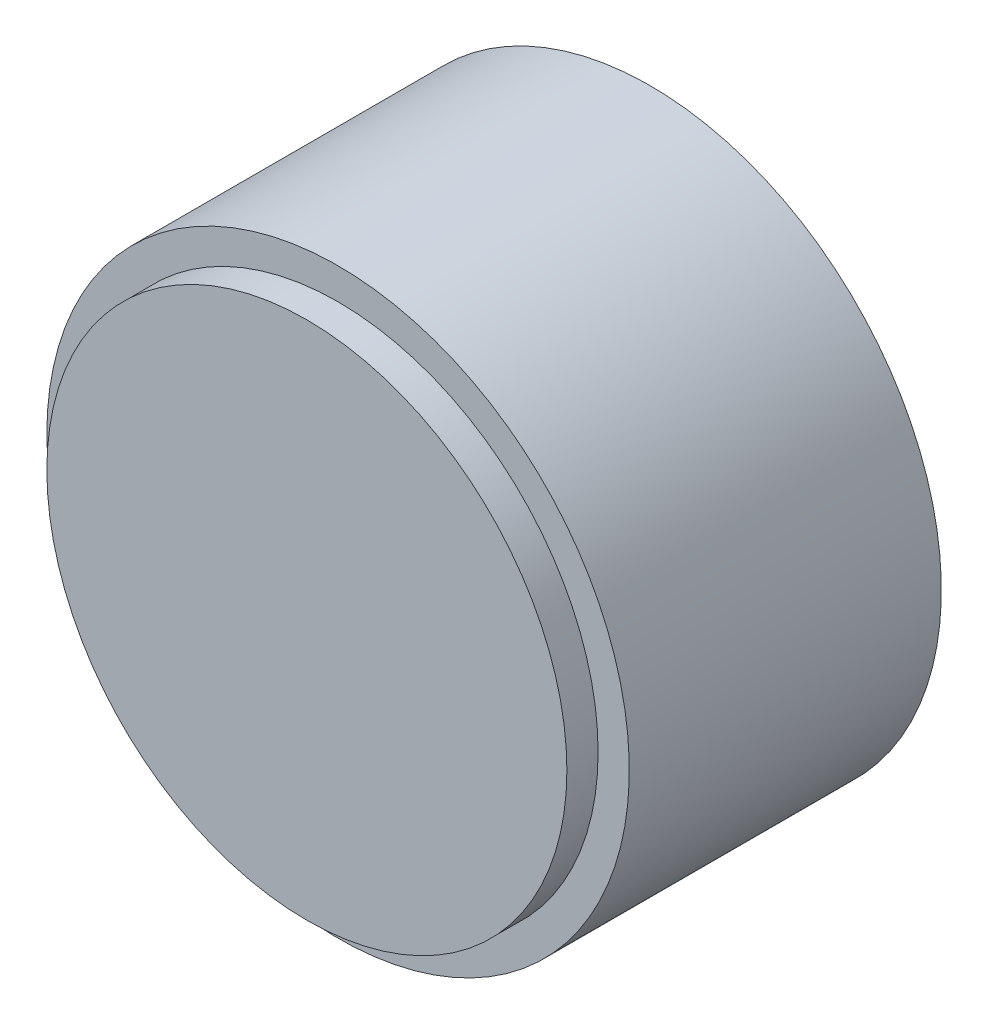
ISO-10303-21;
HEADER;
FILE_DESCRIPTION(('STEP AP214'),'2;1');
FILE_NAME('part.step','',(''),(''),'','','');
FILE_SCHEMA(('AUTOMOTIVE_DESIGN { 1 0 10303 214 1 1 1 1 }'));
ENDSEC;
DATA;
#1=APPLICATION_CONTEXT('core data for automotive mechanical design processes');
#2=APPLICATION_PROTOCOL_DEFINITION('international standard','automotive_design',2000,#1);
#3=PRODUCT_CONTEXT('',#1,'mechanical');
#4=PRODUCT('Part','Part','',(#3));
#5=PRODUCT_RELATED_PRODUCT_CATEGORY('part','',(#4));
#6=PRODUCT_DEFINITION_FORMATION('','',#4);
#7=PRODUCT_DEFINITION_CONTEXT('part definition',#1,'design');
#8=PRODUCT_DEFINITION('design','',#6,#7);
#9=PRODUCT_DEFINITION_SHAPE('','',#8);
#10=(LENGTH_UNIT() NAMED_UNIT(*) SI_UNIT(.MILLI.,.METRE.));
#11=(NAMED_UNIT(*) PLANE_ANGLE_UNIT() SI_UNIT($,.RADIAN.));
#12=(NAMED_UNIT(*) SI_UNIT($,.STERADIAN.) SOLID_ANGLE_UNIT());
#13=UNCERTAINTY_MEASURE_WITH_UNIT(LENGTH_MEASURE(1.E-05),#10,'distance_accuracy_value','');
#14=(GEOMETRIC_REPRESENTATION_CONTEXT(3) GLOBAL_UNCERTAINTY_ASSIGNED_CONTEXT((#13)) GLOBAL_UNIT_ASSIGNED_CONTEXT((#10,
#11,#12)) REPRESENTATION_CONTEXT('',''));
#15=CARTESIAN_POINT('',(0.,0.,0.));
#16=DIRECTION('',(0.,0.,1.));
#17=DIRECTION('',(1.,0.,0.));
#18=AXIS2_PLACEMENT_3D('',#15,#16,#17);
#19=CARTESIAN_POINT('',(0.,0.,-5.));
#20=DIRECTION('',(0.,0.,1.));
#21=DIRECTION('',(1.,0.,0.));
#22=AXIS2_PLACEMENT_3D('',#19,#20,#21);
#23=CYLINDRICAL_SURFACE('',#22,7.);
#24=CARTESIAN_POINT('',(0.,0.,-5.));
#25=DIRECTION('',(0.,0.,-1.));
#26=DIRECTION('',(-1.,0.,0.));
#27=AXIS2_PLACEMENT_3D('',#24,#25,#26);
#28=CIRCLE('',#27,7.);
#29=CARTESIAN_POINT('',(-7.,0.,-5.));
#30=VERTEX_POINT('',#29);
#31=EDGE_CURVE('E60',#30,#30,#28,.T.);
#32=ORIENTED_EDGE('',*,*,#31,.F.);
#33=EDGE_LOOP('',(#32));
#34=FACE_BOUND('',#33,.T.);
#35=CARTESIAN_POINT('',(0.,0.,0.));
#36=DIRECTION('',(0.,0.,-1.));
#37=DIRECTION('',(-1.,0.,0.));
#38=AXIS2_PLACEMENT_3D('',#35,#36,#37);
#39=CIRCLE('',#38,7.);
#40=CARTESIAN_POINT('',(-7.,0.,0.));
#41=VERTEX_POINT('',#40);
#42=EDGE_CURVE('E10',#41,#41,#39,.T.);
#43=ORIENTED_EDGE('',*,*,#42,.T.);
#44=EDGE_LOOP('',(#43));
#45=FACE_BOUND('',#44,.T.);
#46=CARTESIAN_POINT('',(0.,7.,-4.));
#47=CARTESIAN_POINT('',(-0.0832358860906166,6.99999846043226,-3.9999971004257));
#48=CARTESIAN_POINT('',(-0.166507195600275,6.9985002594971,-3.99304839161214));
#49=CARTESIAN_POINT('',(-0.330687344293327,6.99266829827728,-3.96546434314641));
#50=CARTESIAN_POINT('',(-0.41159440357119,6.98833245637099,-3.94481895580507));
#51=CARTESIAN_POINT('',(-0.568649323817737,6.97730831788827,-3.89051563539196));
#52=CARTESIAN_POINT('',(-0.644801963446556,6.97062242967171,-3.85687102061868));
#53=CARTESIAN_POINT('',(-0.790378177960787,6.95562106817971,-3.77756591382874));
#54=CARTESIAN_POINT('',(-0.859801981747369,6.94730565036661,-3.73190583075006));
#55=CARTESIAN_POINT('',(-0.991024790535229,6.92981369246311,-3.62911970032649));
#56=CARTESIAN_POINT('',(-1.05270503419445,6.92062683143259,-3.57184377810147));
#57=CARTESIAN_POINT('',(-1.16566042389435,6.90250069814144,-3.4477736843148));
#58=CARTESIAN_POINT('',(-1.21693467150908,6.8935614473163,-3.38097869174874));
#59=CARTESIAN_POINT('',(-1.30814204379809,6.87684116047225,-3.23889424713957));
#60=CARTESIAN_POINT('',(-1.34794958335009,6.8690733634436,-3.16352248224379));
#61=CARTESIAN_POINT('',(-1.41428823691148,6.85572325558537,-3.00696554623316));
#62=CARTESIAN_POINT('',(-1.44082087001716,6.85014069470711,-2.92578104150743));
#63=CARTESIAN_POINT('',(-1.47946574422454,6.84189808926311,-2.76118891341192));
#64=CARTESIAN_POINT('',(-1.49178779748342,6.83919556896486,-2.67783272433613));
#65=CARTESIAN_POINT('',(-1.50231395206577,6.83689139845106,-2.510195767493));
#66=CARTESIAN_POINT('',(-1.50051971664629,6.83728938291729,-2.42591510982005));
#67=CARTESIAN_POINT('',(-1.48303326340861,6.84110276603832,-2.26037531206621));
#68=CARTESIAN_POINT('',(-1.46758398649408,6.84446541682162,-2.17908911089985));
#69=CARTESIAN_POINT('',(-1.42361054298677,6.85374593375788,-2.02028975971066));
#70=CARTESIAN_POINT('',(-1.39508566936466,6.85966393808402,-1.94277681396768));
#71=CARTESIAN_POINT('',(-1.32554551075991,6.87344080755724,-1.79303712712666));
#72=CARTESIAN_POINT('',(-1.2844361097283,6.88131420983365,-1.72085548728745));
#73=CARTESIAN_POINT('',(-1.19096007283993,6.89810572501288,-1.58432483504204));
#74=CARTESIAN_POINT('',(-1.13859196103562,6.90702397481896,-1.5199768513138));
#75=CARTESIAN_POINT('',(-1.0227954275532,6.92512718393878,-1.3995406443266));
#76=CARTESIAN_POINT('',(-0.959160233964409,6.93431383972178,-1.34365129341526));
#77=CARTESIAN_POINT('',(-0.823317306269096,6.95175017497059,-1.24330626631034));
#78=CARTESIAN_POINT('',(-0.751109428775399,6.95999983875972,-1.19885078139961));
#79=CARTESIAN_POINT('',(-0.599933462049958,6.97465778534003,-1.12258932009307));
#80=CARTESIAN_POINT('',(-0.520952258863482,6.98106238643354,-1.09080858742202));
#81=CARTESIAN_POINT('',(-0.358603146685706,6.99128109245334,-1.04102435167891));
#82=CARTESIAN_POINT('',(-0.275235851133668,6.99509555860384,-1.02301892743668));
#83=CARTESIAN_POINT('',(-0.108187670836628,6.99965306347808,-1.00158378585658));
#84=CARTESIAN_POINT('',(-0.0245431772716141,7.00045336521066,-0.99788228711822));
#85=CARTESIAN_POINT('',(0.142168973650405,6.99905248935969,-1.00442457112516));
#86=CARTESIAN_POINT('',(0.225236668127256,6.99685150675698,-1.01466744796294));
#87=CARTESIAN_POINT('',(0.387542537982806,6.98973143045266,-1.0485822436617));
#88=CARTESIAN_POINT('',(0.466811712908478,6.9848410504546,-1.07211236947253));
#89=CARTESIAN_POINT('',(0.620278450473418,6.9728892442151,-1.13177694299482));
#90=CARTESIAN_POINT('',(0.69447559258774,6.96582763822237,-1.16791243431165));
#91=CARTESIAN_POINT('',(0.836821397964754,6.950175043904,-1.25233354306033));
#92=CARTESIAN_POINT('',(0.90487257511114,6.94156431354275,-1.30077979490973));
#93=CARTESIAN_POINT('',(1.0319769255236,6.92381033034847,-1.40823482488874));
#94=CARTESIAN_POINT('',(1.091028978692,6.91466701142097,-1.46724491588744));
#95=CARTESIAN_POINT('',(1.19952711057989,6.89668172706324,-1.59539737018714));
#96=CARTESIAN_POINT('',(1.24878537255157,6.88784792221285,-1.6647000992221));
#97=CARTESIAN_POINT('',(1.3349641538604,6.87166654559681,-1.81075459647799));
#98=CARTESIAN_POINT('',(1.37188519913706,6.86431891048055,-1.88750604697749));
#99=CARTESIAN_POINT('',(1.43209741248548,6.8520100980739,-2.0458722989946));
#100=CARTESIAN_POINT('',(1.45546398641275,6.84703574582967,-2.12745735643067));
#101=CARTESIAN_POINT('',(1.48812696085335,6.84001186708418,-2.29351558383364));
#102=CARTESIAN_POINT('',(1.49742550780258,6.83796189439706,-2.37798831120132));
#103=CARTESIAN_POINT('',(1.5015999992604,6.83704618848155,-2.54553234317524));
#104=CARTESIAN_POINT('',(1.49677347258311,6.83811476518543,-2.62859601498058));
#105=CARTESIAN_POINT('',(1.47349789406331,6.8431676318483,-2.79269724213259));
#106=CARTESIAN_POINT('',(1.45504898957979,6.84715189026714,-2.87373481938657));
#107=CARTESIAN_POINT('',(1.40519345940434,6.85755581104157,-3.03125865786917));
#108=CARTESIAN_POINT('',(1.37382847170887,6.86396764224703,-3.10775864866429));
#109=CARTESIAN_POINT('',(1.29906751595601,6.87850764590649,-3.25445537250685));
#110=CARTESIAN_POINT('',(1.255670353015,6.88663598880363,-3.32465147861504));
#111=CARTESIAN_POINT('',(1.15708290349304,6.90389055593232,-3.45821819372537));
#112=CARTESIAN_POINT('',(1.10167987421237,6.91303309938926,-3.52142969594698));
#113=CARTESIAN_POINT('',(0.981086554619619,6.93117449799694,-3.63775626252046));
#114=CARTESIAN_POINT('',(0.915894009385596,6.94017331951296,-3.69086899431221));
#115=CARTESIAN_POINT('',(0.776603147268716,6.95714491048987,-3.78611595950556));
#116=CARTESIAN_POINT('',(0.702404846009641,6.96510364570626,-3.82810660623098));
#117=CARTESIAN_POINT('',(0.547850160940598,6.97895826104019,-3.89895452890618));
#118=CARTESIAN_POINT('',(0.467499105863879,6.98485590212343,-3.92782302258504));
#119=CARTESIAN_POINT('',(0.322535217553203,6.99284848461772,-3.96635218513115));
#120=CARTESIAN_POINT('',(0.258717205545978,6.99551391888263,-3.97894643398003));
#121=CARTESIAN_POINT('',(0.129939960853846,6.99909024154719,-3.99577130171167));
#122=CARTESIAN_POINT('',(0.0649807750887446,7.00000120191314,-4.00000226364606));
#123=CARTESIAN_POINT('',(0.,7.,-4.));
#124=B_SPLINE_CURVE_WITH_KNOTS('',3,(#46,#47,#48,#49,#50,#51,#52,#53,#54,#55,#56,#57,#58,#59,
#60,#61,#62,#63,#64,#65,#66,#67,#68,#69,#70,#71,#72,#73,#74,#75,#76,#77,#78,#79,#80,#81,#82,#83,
#84,#85,#86,#87,#88,#89,#90,#91,#92,#93,#94,#95,#96,#97,#98,#99,#100,#101,#102,#103,#104,#105,
#106,#107,#108,#109,#110,#111,#112,#113,#114,#115,#116,#117,#118,#119,#120,#121,#122,#123),
.UNSPECIFIED.,.T.,.F.,(4,2,2,2,2,2,2,2,2,2,2,2,2,2,2,2,2,2,2,2,2,2,2,2,2,2,2,2,2,2,2,2,2,2,2,2,
2,2,4),(0.,0.249469836512082,0.499122883219936,0.748520824425602,0.997910278645886,
1.25074961881732,1.50361077918506,1.7591442921451,2.0146485567749,2.26633008124666,
2.51798195169165,2.76524475452928,3.01252092904568,3.26169356165968,3.51089887920889,
3.76527011050291,4.0196455970235,4.27452521139806,4.52936927256343,4.77934665704185,
5.02930780231429,5.27665060589267,5.52401389198434,5.77478733867803,6.02559197304485,
6.28082063283534,6.53603841075806,6.78982240408475,7.04356767229185,7.29200680540294,
7.5404432510827,7.78808499706785,8.03575134451623,8.28822950154114,8.54076590397115,
8.79641910357222,9.05185334010271,9.24661799132294,9.44137465337336),.UNSPECIFIED.);
#125=CARTESIAN_POINT('',(0.,7.,-4.));
#126=VERTEX_POINT('',#125);
#127=EDGE_CURVE('E115',#126,#126,#124,.T.);
#128=ORIENTED_EDGE('',*,*,#127,.F.);
#129=EDGE_LOOP('',(#128));
#130=FACE_BOUND('',#129,.T.);
#131=ADVANCED_FACE('F37',(#34,#45,#130),#23,.T.);
#132=CARTESIAN_POINT('',(0.,0.,-5.));
#133=DIRECTION('',(0.,0.,1.));
#134=DIRECTION('',(1.,0.,0.));
#135=AXIS2_PLACEMENT_3D('',#132,#133,#134);
#136=CYLINDRICAL_SURFACE('',#135,2.);
#137=CARTESIAN_POINT('',(0.,0.,0.));
#138=DIRECTION('',(0.,0.,-1.));
#139=DIRECTION('',(-1.,0.,0.));
#140=AXIS2_PLACEMENT_3D('',#137,#138,#139);
#141=CIRCLE('',#140,2.);
#142=CARTESIAN_POINT('',(-2.,0.,0.));
#143=VERTEX_POINT('',#142);
#144=EDGE_CURVE('E122',#143,#143,#141,.T.);
#145=ORIENTED_EDGE('',*,*,#144,.F.);
#146=EDGE_LOOP('',(#145));
#147=FACE_BOUND('',#146,.T.);
#148=CARTESIAN_POINT('',(0.,0.,-5.));
#149=DIRECTION('',(0.,0.,-1.));
#150=DIRECTION('',(-1.,0.,0.));
#151=AXIS2_PLACEMENT_3D('',#148,#149,#150);
#152=CIRCLE('',#151,2.);
#153=CARTESIAN_POINT('',(-2.,0.,-5.));
#154=VERTEX_POINT('',#153);
#155=EDGE_CURVE('E123',#154,#154,#152,.T.);
#156=ORIENTED_EDGE('',*,*,#155,.T.);
#157=EDGE_LOOP('',(#156));
#158=FACE_BOUND('',#157,.T.);
#159=CARTESIAN_POINT('',(0.,2.,-4.));
#160=CARTESIAN_POINT('',(-0.0732207358411543,1.99999540196395,-3.99999520798798));
#161=CARTESIAN_POINT('',(-0.146561062021485,1.99593645526274,-3.9945949756255));
#162=CARTESIAN_POINT('',(-0.290936396286467,1.98006607281083,-3.97333293658984));
#163=CARTESIAN_POINT('',(-0.361965136229004,1.96823514679854,-3.95744482834995));
#164=CARTESIAN_POINT('',(-0.499234626631249,1.9379567495606,-3.91628709071623));
#165=CARTESIAN_POINT('',(-0.565501615403737,1.91954951932009,-3.89107448643083));
#166=CARTESIAN_POINT('',(-0.692422335520753,1.87750556721694,-3.83245765581277));
#167=CARTESIAN_POINT('',(-0.753077701796332,1.85387037535483,-3.79905582580648));
#168=CARTESIAN_POINT('',(-0.873465937590145,1.80049544543983,-3.72173698840918));
#169=CARTESIAN_POINT('',(-0.932593229272032,1.7703930854844,-3.67713267066593));
#170=CARTESIAN_POINT('',(-1.04302716767671,1.70767017883378,-3.58050416263883));
#171=CARTESIAN_POINT('',(-1.09432148272226,1.67504578078609,-3.52846851720017));
#172=CARTESIAN_POINT('',(-1.19837161436623,1.6027112365199,-3.40641704672163));
#173=CARTESIAN_POINT('',(-1.24930578421204,1.56290854864639,-3.3348963228783));
#174=CARTESIAN_POINT('',(-1.33861998176348,1.48711444664135,-3.18254898763345));
#175=CARTESIAN_POINT('',(-1.37701716983077,1.45111786883675,-3.10173530299969));
#176=CARTESIAN_POINT('',(-1.42880627811788,1.39977155180179,-2.96049716132377));
#177=CARTESIAN_POINT('',(-1.44625674456539,1.38157751186733,-2.90260930287162));
#178=CARTESIAN_POINT('',(-1.47420672564844,1.35171594150685,-2.78360726521508));
#179=CARTESIAN_POINT('',(-1.48472215355267,1.34003347910832,-2.72250082212521));
#180=CARTESIAN_POINT('',(-1.49812822141445,1.32503759684553,-2.59781741446923));
#181=CARTESIAN_POINT('',(-1.50094954854207,1.32180026676597,-2.53422319327594));
#182=CARTESIAN_POINT('',(-1.49848213241869,1.32459531776068,-2.40738508911843));
#183=CARTESIAN_POINT('',(-1.49319048157349,1.33063102218113,-2.34414133991256));
#184=CARTESIAN_POINT('',(-1.47597739291882,1.34967623262519,-2.22680865257421));
#185=CARTESIAN_POINT('',(-1.46482486380817,1.36187157059871,-2.17246362895382));
#186=CARTESIAN_POINT('',(-1.43705671120732,1.39114192844939,-2.06656112127912));
#187=CARTESIAN_POINT('',(-1.42043583681172,1.40822163640769,-2.0150063721764));
#188=CARTESIAN_POINT('',(-1.37033064172535,1.45741769294306,-1.88374361336585));
#189=CARTESIAN_POINT('',(-1.3328014849398,1.49225649139233,-1.80659958335649));
#190=CARTESIAN_POINT('',(-1.24618023314519,1.56533298145196,-1.66080347613092));
#191=CARTESIAN_POINT('',(-1.19706004255878,1.60357878886109,-1.59217266074534));
#192=CARTESIAN_POINT('',(-1.08651604102135,1.68051672313145,-1.46224660959635));
#193=CARTESIAN_POINT('',(-1.02481375526036,1.71919586730239,-1.40117939311852));
#194=CARTESIAN_POINT('',(-0.890422521709589,1.79248037980972,-1.28973635321884));
#195=CARTESIAN_POINT('',(-0.817755054293756,1.8270934826376,-1.23934007976962));
#196=CARTESIAN_POINT('',(-0.677902080454142,1.88279726073643,-1.16001920075967));
#197=CARTESIAN_POINT('',(-0.612539870185619,1.90520770945008,-1.12881540578422));
#198=CARTESIAN_POINT('',(-0.476352173202086,1.94372904416948,-1.07577511953614));
#199=CARTESIAN_POINT('',(-0.405530141063765,1.95984387504352,-1.05393276150072));
#200=CARTESIAN_POINT('',(-0.259676232483518,1.98445588635989,-1.02074663711356));
#201=CARTESIAN_POINT('',(-0.184621281405942,1.99290592971749,-1.00946782106137));
#202=CARTESIAN_POINT('',(-0.0332012397969162,2.00115883659445,-0.998450402628294));
#203=CARTESIAN_POINT('',(0.0431632843727241,2.00096534845408,-0.998706931304634));
#204=CARTESIAN_POINT('',(0.186804217329626,1.99242547175873,-1.01011086927319));
#205=CARTESIAN_POINT('',(0.254222327546133,1.98490086600401,-1.02016053688867));
#206=CARTESIAN_POINT('',(0.386110670609118,1.96351320201588,-1.04897378000787));
#207=CARTESIAN_POINT('',(0.450580272987261,1.94964879507262,-1.06773920968941));
#208=CARTESIAN_POINT('',(0.57741677968977,1.91599830683313,-1.1138875305931));
#209=CARTESIAN_POINT('',(0.639629172536139,1.89602050290193,-1.1415511814274));
#210=CARTESIAN_POINT('',(0.758518527043073,1.85166985411963,-1.20417245542559));
#211=CARTESIAN_POINT('',(0.815194721336403,1.82729640132068,-1.23913108763974));
#212=CARTESIAN_POINT('',(0.931511626319037,1.77119146886499,-1.32178324641056));
#213=CARTESIAN_POINT('',(0.990066762698702,1.73891095025037,-1.37062853943746));
#214=CARTESIAN_POINT('',(1.09871974855854,1.67238952874785,-1.47600875258839));
#215=CARTESIAN_POINT('',(1.14879830469577,1.63814438507395,-1.53256069969336));
#216=CARTESIAN_POINT('',(1.24877541075626,1.56369128291497,-1.66414988096118));
#217=CARTESIAN_POINT('',(1.29683043648705,1.523587185201,-1.7406575614923));
#218=CARTESIAN_POINT('',(1.37923235998283,1.4494059134845,-1.90336007797245));
#219=CARTESIAN_POINT('',(1.41362000515519,1.41531099570969,-1.98952512190858));
#220=CARTESIAN_POINT('',(1.45615734256767,1.37118877808583,-2.13541444887448));
#221=CARTESIAN_POINT('',(1.46931009512996,1.35695811824565,-2.19239112640238));
#222=CARTESIAN_POINT('',(1.48891522181906,1.33542056103011,-2.30870704698318));
#223=CARTESIAN_POINT('',(1.4953825519924,1.32809821220233,-2.36804070680225));
#224=CARTESIAN_POINT('',(1.50115320209064,1.32157601792209,-2.48782907981133));
#225=CARTESIAN_POINT('',(1.50042015325262,1.32241740684975,-2.54828794300957));
#226=CARTESIAN_POINT('',(1.49176883838219,1.33216448543666,-2.66805683875216));
#227=CARTESIAN_POINT('',(1.48384130024584,1.34108058157484,-2.72736528789726));
#228=CARTESIAN_POINT('',(1.45893841819723,1.36817348797773,-2.8559145714108));
#229=CARTESIAN_POINT('',(1.44036567954111,1.38794705950643,-2.92449718013277));
#230=CARTESIAN_POINT('',(1.39469627266119,1.4338296338541,-3.05653484883048));
#231=CARTESIAN_POINT('',(1.3675780729773,1.4599546014693,-3.11997644203819));
#232=CARTESIAN_POINT('',(1.29498918933642,1.52516477328824,-3.26252063048633));
#233=CARTESIAN_POINT('',(1.2464154206597,1.56560203191105,-3.33942158275575));
#234=CARTESIAN_POINT('',(1.13650718465936,1.64713510181273,-3.48312604497756));
#235=CARTESIAN_POINT('',(1.07516134758577,1.68823146954222,-3.54992046594485));
#236=CARTESIAN_POINT('',(0.93962714493789,1.76728988939793,-3.67283184228333));
#237=CARTESIAN_POINT('',(0.865337161562859,1.80522333711072,-3.7288563193772));
#238=CARTESIAN_POINT('',(0.705159098936202,1.87357289668097,-3.82722305114535));
#239=CARTESIAN_POINT('',(0.619299420401793,1.90400691592959,-3.86959797457251));
#240=CARTESIAN_POINT('',(0.464840290356453,1.94636704624048,-3.92779942098571));
#241=CARTESIAN_POINT('',(0.398553614774731,1.96110322499718,-3.94776673137617));
#242=CARTESIAN_POINT('',(0.262841610392759,1.98383739970238,-3.97841790261149));
#243=CARTESIAN_POINT('',(0.193425623834904,1.99185421210894,-3.98912769024996));
#244=CARTESIAN_POINT('',(0.102963309861888,1.99745471706309,-3.99660469421435));
#245=CARTESIAN_POINT('',(0.0824069459941229,1.9984076143208,-3.99787627748942));
#246=CARTESIAN_POINT('',(0.0412368896243779,1.99968095423138,-3.99957467323097));
#247=CARTESIAN_POINT('',(0.0206231884283879,2.00000129507253,-4.00000134970737));
#248=CARTESIAN_POINT('',(0.,2.,-4.));
#249=B_SPLINE_CURVE_WITH_KNOTS('',3,(#159,#160,#161,#162,#163,#164,#165,#166,#167,#168,#169,
#170,#171,#172,#173,#174,#175,#176,#177,#178,#179,#180,#181,#182,#183,#184,#185,#186,#187,#188,
#189,#190,#191,#192,#193,#194,#195,#196,#197,#198,#199,#200,#201,#202,#203,#204,#205,#206,#207,
#208,#209,#210,#211,#212,#213,#214,#215,#216,#217,#218,#219,#220,#221,#222,#223,#224,#225,#226,
#227,#228,#229,#230,#231,#232,#233,#234,#235,#236,#237,#238,#239,#240,#241,#242,#243,#244,#245,
#246,#247,#248),.UNSPECIFIED.,.T.,.F.,(4,2,2,2,2,2,2,2,2,2,2,2,2,2,2,2,2,2,2,2,2,2,2,2,2,2,2,2,
2,2,2,2,2,2,2,2,2,2,2,2,2,2,2,2,4),(0.,0.219571786572042,0.439696319423243,0.658496333573381,
0.877232398849293,1.1162243131743,1.35558868405162,1.64360015887451,1.93121574056507,
2.11999518529901,2.3083399319529,2.49837587621257,2.6884799430021,2.85826890162709,
3.0282213760064,3.3044933180591,3.58144192357889,3.8653588393809,4.14872662493691,
4.37526505006389,4.60166129643117,4.82944058166898,5.05712372466613,5.26191187011994,
5.46674360185812,5.6788043948368,5.89089453977541,6.13840382081868,6.38646908985452,
6.68168596015947,6.97601595850113,7.15589161422933,7.33536399114208,7.51574333854741,
7.69635548563854,7.91639670960134,8.13699685139921,8.43412246655768,8.73151372390893,
9.0313544949265,9.33047220273164,9.5419569754163,9.75284752283256,9.81468166878711,
9.87652576630966),.UNSPECIFIED.);
#250=CARTESIAN_POINT('',(0.,2.,-4.));
#251=VERTEX_POINT('',#250);
#252=EDGE_CURVE('E41',#251,#251,#249,.T.);
#253=ORIENTED_EDGE('',*,*,#252,.T.);
#254=EDGE_LOOP('',(#253));
#255=FACE_BOUND('',#254,.T.);
#256=ADVANCED_FACE('F103',(#147,#158,#255),#136,.F.);
#257=CARTESIAN_POINT('',(0.,0.,35.));
#258=DIRECTION('',(0.,0.,-1.));
#259=DIRECTION('',(-1.,0.,0.));
#260=AXIS2_PLACEMENT_3D('',#257,#258,#259);
#261=CYLINDRICAL_SURFACE('',#260,25.);
#262=CARTESIAN_POINT('',(0.,0.,35.));
#263=DIRECTION('',(0.,0.,1.));
#264=DIRECTION('',(1.,0.,0.));
#265=AXIS2_PLACEMENT_3D('',#262,#263,#264);
#266=CIRCLE('',#265,25.);
#267=CARTESIAN_POINT('',(25.,0.,35.));
#268=VERTEX_POINT('',#267);
#269=EDGE_CURVE('E57',#268,#268,#266,.T.);
#270=ORIENTED_EDGE('',*,*,#269,.F.);
#271=EDGE_LOOP('',(#270));
#272=FACE_BOUND('',#271,.T.);
#273=CARTESIAN_POINT('',(0.,0.,32.));
#274=DIRECTION('',(0.,0.,-1.));
#275=DIRECTION('',(-1.,0.,0.));
#276=AXIS2_PLACEMENT_3D('',#273,#274,#275);
#277=CIRCLE('',#276,25.);
#278=CARTESIAN_POINT('',(-25.,0.,32.));
#279=VERTEX_POINT('',#278);
#280=EDGE_CURVE('E51',#279,#279,#277,.T.);
#281=ORIENTED_EDGE('',*,*,#280,.F.);
#282=EDGE_LOOP('',(#281));
#283=FACE_BOUND('',#282,.T.);
#284=ADVANCED_FACE('F94',(#272,#283),#261,.T.);
#285=CARTESIAN_POINT('',(0.,0.,35.));
#286=DIRECTION('',(0.,0.,1.));
#287=DIRECTION('',(1.,0.,0.));
#288=AXIS2_PLACEMENT_3D('',#285,#286,#287);
#289=PLANE('',#288);
#290=ORIENTED_EDGE('',*,*,#269,.T.);
#291=EDGE_LOOP('',(#290));
#292=FACE_BOUND('',#291,.T.);
#293=ADVANCED_FACE('F180',(#292),#289,.T.);
#294=CARTESIAN_POINT('',(0.,0.,32.));
#295=DIRECTION('',(0.,0.,-1.));
#296=DIRECTION('',(-1.,0.,0.));
#297=AXIS2_PLACEMENT_3D('',#294,#295,#296);
#298=CYLINDRICAL_SURFACE('',#297,28.);
#299=CARTESIAN_POINT('',(0.,0.,32.));
#300=DIRECTION('',(0.,0.,-1.));
#301=DIRECTION('',(-1.,0.,0.));
#302=AXIS2_PLACEMENT_3D('',#299,#300,#301);
#303=CIRCLE('',#302,28.);
#304=CARTESIAN_POINT('',(-28.,0.,32.));
#305=VERTEX_POINT('',#304);
#306=EDGE_CURVE('E67',#305,#305,#303,.T.);
#307=ORIENTED_EDGE('',*,*,#306,.T.);
#308=EDGE_LOOP('',(#307));
#309=FACE_BOUND('',#308,.T.);
#310=CARTESIAN_POINT('',(0.,0.,2.));
#311=DIRECTION('',(0.,0.,-1.));
#312=DIRECTION('',(-1.,0.,0.));
#313=AXIS2_PLACEMENT_3D('',#310,#311,#312);
#314=CIRCLE('',#313,28.);
#315=CARTESIAN_POINT('',(-28.,0.,2.));
#316=VERTEX_POINT('',#315);
#317=EDGE_CURVE('E66',#316,#316,#314,.T.);
#318=ORIENTED_EDGE('',*,*,#317,.F.);
#319=EDGE_LOOP('',(#318));
#320=FACE_BOUND('',#319,.T.);
#321=ADVANCED_FACE('F188',(#309,#320),#298,.T.);
#322=CARTESIAN_POINT('',(0.,0.,32.));
#323=DIRECTION('',(0.,0.,-1.));
#324=DIRECTION('',(-1.,0.,0.));
#325=AXIS2_PLACEMENT_3D('',#322,#323,#324);
#326=PLANE('',#325);
#327=ORIENTED_EDGE('',*,*,#280,.T.);
#328=EDGE_LOOP('',(#327));
#329=FACE_BOUND('',#328,.T.);
#330=ORIENTED_EDGE('',*,*,#306,.F.);
#331=EDGE_LOOP('',(#330));
#332=FACE_BOUND('',#331,.T.);
#333=ADVANCED_FACE('F95',(#329,#332),#326,.F.);
#334=CARTESIAN_POINT('',(0.,0.,2.));
#335=DIRECTION('',(0.,0.,-1.));
#336=DIRECTION('',(-1.,0.,0.));
#337=AXIS2_PLACEMENT_3D('',#334,#335,#336);
#338=PLANE('',#337);
#339=CARTESIAN_POINT('',(0.,0.,2.));
#340=DIRECTION('',(0.,0.,-1.));
#341=DIRECTION('',(-1.,0.,0.));
#342=AXIS2_PLACEMENT_3D('',#339,#340,#341);
#343=CIRCLE('',#342,25.);
#344=CARTESIAN_POINT('',(-25.,0.,2.));
#345=VERTEX_POINT('',#344);
#346=EDGE_CURVE('E62',#345,#345,#343,.T.);
#347=ORIENTED_EDGE('',*,*,#346,.F.);
#348=EDGE_LOOP('',(#347));
#349=FACE_BOUND('',#348,.T.);
#350=ORIENTED_EDGE('',*,*,#317,.T.);
#351=EDGE_LOOP('',(#350));
#352=FACE_BOUND('',#351,.T.);
#353=ADVANCED_FACE('F85',(#349,#352),#338,.T.);
#354=CARTESIAN_POINT('',(0.,0.,0.));
#355=DIRECTION('',(0.,0.,1.));
#356=DIRECTION('',(1.,0.,0.));
#357=AXIS2_PLACEMENT_3D('',#354,#355,#356);
#358=PLANE('',#357);
#359=ORIENTED_EDGE('',*,*,#42,.F.);
#360=EDGE_LOOP('',(#359));
#361=FACE_BOUND('',#360,.T.);
#362=CARTESIAN_POINT('',(0.,0.,0.));
#363=DIRECTION('',(0.,0.,1.));
#364=DIRECTION('',(1.,0.,0.));
#365=AXIS2_PLACEMENT_3D('',#362,#363,#364);
#366=CIRCLE('',#365,25.);
#367=CARTESIAN_POINT('',(25.,0.,0.));
#368=VERTEX_POINT('',#367);
#369=EDGE_CURVE('E71',#368,#368,#366,.T.);
#370=ORIENTED_EDGE('',*,*,#369,.F.);
#371=EDGE_LOOP('',(#370));
#372=FACE_BOUND('',#371,.T.);
#373=ADVANCED_FACE('F83',(#361,#372),#358,.F.);
#374=ORIENTED_EDGE('',*,*,#346,.T.);
#375=EDGE_LOOP('',(#374));
#376=FACE_BOUND('',#375,.T.);
#377=ORIENTED_EDGE('',*,*,#369,.T.);
#378=EDGE_LOOP('',(#377));
#379=FACE_BOUND('',#378,.T.);
#380=ADVANCED_FACE('F39',(#376,#379),#261,.T.);
#381=CARTESIAN_POINT('',(0.,0.,-5.));
#382=DIRECTION('',(0.,0.,-1.));
#383=DIRECTION('',(-1.,0.,0.));
#384=AXIS2_PLACEMENT_3D('',#381,#382,#383);
#385=PLANE('',#384);
#386=ORIENTED_EDGE('',*,*,#31,.T.);
#387=EDGE_LOOP('',(#386));
#388=FACE_BOUND('',#387,.T.);
#389=ORIENTED_EDGE('',*,*,#155,.F.);
#390=EDGE_LOOP('',(#389));
#391=FACE_BOUND('',#390,.T.);
#392=ADVANCED_FACE('F92',(#388,#391),#385,.T.);
#393=ORIENTED_EDGE('',*,*,#144,.T.);
#394=EDGE_LOOP('',(#393));
#395=FACE_BOUND('',#394,.T.);
#396=ADVANCED_FACE('F87',(#395),#358,.F.);
#397=CARTESIAN_POINT('',(0.,28.,-2.5));
#398=DIRECTION('',(0.,-1.,0.));
#399=DIRECTION('',(0.,0.,-1.));
#400=AXIS2_PLACEMENT_3D('',#397,#398,#399);
#401=CYLINDRICAL_SURFACE('',#400,1.5);
#402=ORIENTED_EDGE('',*,*,#252,.F.);
#403=EDGE_LOOP('',(#402));
#404=FACE_BOUND('',#403,.T.);
#405=ORIENTED_EDGE('',*,*,#127,.T.);
#406=EDGE_LOOP('',(#405));
#407=FACE_BOUND('',#406,.T.);
#408=ADVANCED_FACE('F100',(#404,#407),#401,.F.);
#409=CLOSED_SHELL('',(#131,#256,#284,#293,#321,#333,#353,#373,#380,#392,#396,#408));
#410=MANIFOLD_SOLID_BREP('B2',#409);
#411=ADVANCED_BREP_SHAPE_REPRESENTATION('',(#18,#410),#14);
#412=SHAPE_DEFINITION_REPRESENTATION(#9,#411);
ENDSEC;
END-ISO-10303-21;
